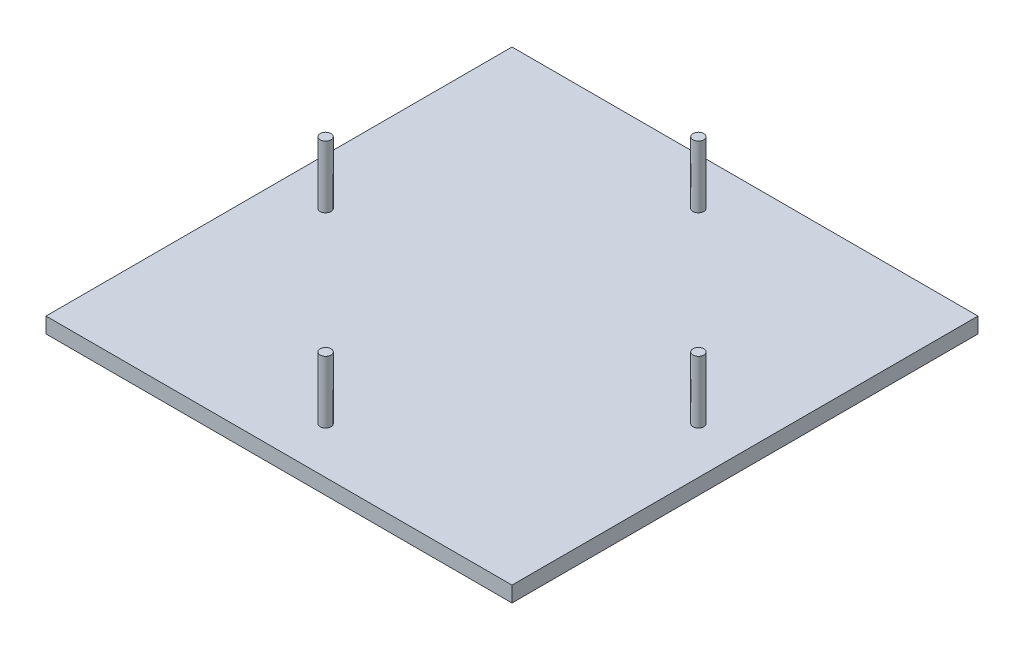
ISO-10303-21;
HEADER;
FILE_DESCRIPTION(('STEP AP214'),'2;1');
FILE_NAME('part.step','',(''),(''),'','','');
FILE_SCHEMA(('AUTOMOTIVE_DESIGN { 1 0 10303 214 1 1 1 1 }'));
ENDSEC;
DATA;
#1=APPLICATION_CONTEXT('core data for automotive mechanical design processes');
#2=APPLICATION_PROTOCOL_DEFINITION('international standard','automotive_design',2000,#1);
#3=PRODUCT_CONTEXT('',#1,'mechanical');
#4=PRODUCT('Part','Part','',(#3));
#5=PRODUCT_RELATED_PRODUCT_CATEGORY('part','',(#4));
#6=PRODUCT_DEFINITION_FORMATION('','',#4);
#7=PRODUCT_DEFINITION_CONTEXT('part definition',#1,'design');
#8=PRODUCT_DEFINITION('design','',#6,#7);
#9=PRODUCT_DEFINITION_SHAPE('','',#8);
#10=(LENGTH_UNIT() NAMED_UNIT(*) SI_UNIT(.MILLI.,.METRE.));
#11=(NAMED_UNIT(*) PLANE_ANGLE_UNIT() SI_UNIT($,.RADIAN.));
#12=(NAMED_UNIT(*) SI_UNIT($,.STERADIAN.) SOLID_ANGLE_UNIT());
#13=UNCERTAINTY_MEASURE_WITH_UNIT(LENGTH_MEASURE(1.E-05),#10,'distance_accuracy_value','');
#14=(GEOMETRIC_REPRESENTATION_CONTEXT(3) GLOBAL_UNCERTAINTY_ASSIGNED_CONTEXT((#13)) GLOBAL_UNIT_ASSIGNED_CONTEXT((#10,
#11,#12)) REPRESENTATION_CONTEXT('',''));
#15=CARTESIAN_POINT('',(0.,0.,0.));
#16=DIRECTION('',(0.,0.,1.));
#17=DIRECTION('',(1.,0.,0.));
#18=AXIS2_PLACEMENT_3D('',#15,#16,#17);
#19=CARTESIAN_POINT('',(75.,5.,-75.));
#20=DIRECTION('',(-1.,0.,0.));
#21=DIRECTION('',(0.,0.,1.));
#22=AXIS2_PLACEMENT_3D('',#19,#20,#21);
#23=PLANE('',#22);
#24=DIRECTION('',(0.,0.,-1.));
#25=VECTOR('',#24,1.);
#26=CARTESIAN_POINT('',(75.,0.,-75.));
#27=LINE('',#26,#25);
#28=CARTESIAN_POINT('',(75.,0.,75.));
#29=VERTEX_POINT('',#28);
#30=CARTESIAN_POINT('',(75.,0.,-75.));
#31=VERTEX_POINT('',#30);
#32=EDGE_CURVE('E116',#29,#31,#27,.T.);
#33=ORIENTED_EDGE('',*,*,#32,.T.);
#34=DIRECTION('',(0.,-1.,0.));
#35=VECTOR('',#34,1.);
#36=CARTESIAN_POINT('',(75.,5.,-75.));
#37=LINE('',#36,#35);
#38=CARTESIAN_POINT('',(75.,5.,-75.));
#39=VERTEX_POINT('',#38);
#40=EDGE_CURVE('E49',#39,#31,#37,.T.);
#41=ORIENTED_EDGE('',*,*,#40,.F.);
#42=DIRECTION('',(0.,0.,-1.));
#43=VECTOR('',#42,1.);
#44=CARTESIAN_POINT('',(75.,5.,-75.));
#45=LINE('',#44,#43);
#46=CARTESIAN_POINT('',(75.,5.,75.));
#47=VERTEX_POINT('',#46);
#48=EDGE_CURVE('E105',#47,#39,#45,.T.);
#49=ORIENTED_EDGE('',*,*,#48,.F.);
#50=DIRECTION('',(0.,-1.,0.));
#51=VECTOR('',#50,1.);
#52=CARTESIAN_POINT('',(75.,5.,75.));
#53=LINE('',#52,#51);
#54=EDGE_CURVE('E113',#47,#29,#53,.T.);
#55=ORIENTED_EDGE('',*,*,#54,.T.);
#56=EDGE_LOOP('',(#33,#41,#49,#55));
#57=FACE_BOUND('',#56,.T.);
#58=ADVANCED_FACE('F50',(#57),#23,.F.);
#59=CARTESIAN_POINT('',(-75.,5.,-75.));
#60=DIRECTION('',(0.,0.,1.));
#61=DIRECTION('',(1.,0.,0.));
#62=AXIS2_PLACEMENT_3D('',#59,#60,#61);
#63=PLANE('',#62);
#64=DIRECTION('',(-1.,0.,0.));
#65=VECTOR('',#64,1.);
#66=CARTESIAN_POINT('',(-75.,0.,-75.));
#67=LINE('',#66,#65);
#68=CARTESIAN_POINT('',(-75.,0.,-75.));
#69=VERTEX_POINT('',#68);
#70=EDGE_CURVE('E107',#31,#69,#67,.T.);
#71=ORIENTED_EDGE('',*,*,#70,.T.);
#72=DIRECTION('',(0.,-1.,0.));
#73=VECTOR('',#72,1.);
#74=CARTESIAN_POINT('',(-75.,5.,-75.));
#75=LINE('',#74,#73);
#76=CARTESIAN_POINT('',(-75.,5.,-75.));
#77=VERTEX_POINT('',#76);
#78=EDGE_CURVE('E106',#77,#69,#75,.T.);
#79=ORIENTED_EDGE('',*,*,#78,.F.);
#80=DIRECTION('',(-1.,0.,0.));
#81=VECTOR('',#80,1.);
#82=CARTESIAN_POINT('',(-75.,5.,-75.));
#83=LINE('',#82,#81);
#84=EDGE_CURVE('E100',#39,#77,#83,.T.);
#85=ORIENTED_EDGE('',*,*,#84,.F.);
#86=ORIENTED_EDGE('',*,*,#40,.T.);
#87=EDGE_LOOP('',(#71,#79,#85,#86));
#88=FACE_BOUND('',#87,.T.);
#89=ADVANCED_FACE('F110',(#88),#63,.F.);
#90=CARTESIAN_POINT('',(-75.,5.,-75.));
#91=DIRECTION('',(1.,0.,0.));
#92=DIRECTION('',(0.,0.,-1.));
#93=AXIS2_PLACEMENT_3D('',#90,#91,#92);
#94=PLANE('',#93);
#95=DIRECTION('',(0.,0.,1.));
#96=VECTOR('',#95,1.);
#97=CARTESIAN_POINT('',(-75.,0.,-75.));
#98=LINE('',#97,#96);
#99=CARTESIAN_POINT('',(-75.,0.,75.));
#100=VERTEX_POINT('',#99);
#101=EDGE_CURVE('E85',#69,#100,#98,.T.);
#102=ORIENTED_EDGE('',*,*,#101,.T.);
#103=DIRECTION('',(0.,-1.,0.));
#104=VECTOR('',#103,1.);
#105=CARTESIAN_POINT('',(-75.,5.,75.));
#106=LINE('',#105,#104);
#107=CARTESIAN_POINT('',(-75.,5.,75.));
#108=VERTEX_POINT('',#107);
#109=EDGE_CURVE('E109',#108,#100,#106,.T.);
#110=ORIENTED_EDGE('',*,*,#109,.F.);
#111=DIRECTION('',(0.,0.,1.));
#112=VECTOR('',#111,1.);
#113=CARTESIAN_POINT('',(-75.,5.,-75.));
#114=LINE('',#113,#112);
#115=EDGE_CURVE('E99',#77,#108,#114,.T.);
#116=ORIENTED_EDGE('',*,*,#115,.F.);
#117=ORIENTED_EDGE('',*,*,#78,.T.);
#118=EDGE_LOOP('',(#102,#110,#116,#117));
#119=FACE_BOUND('',#118,.T.);
#120=ADVANCED_FACE('F112',(#119),#94,.F.);
#121=CARTESIAN_POINT('',(-75.,5.,75.));
#122=DIRECTION('',(0.,0.,-1.));
#123=DIRECTION('',(-1.,0.,0.));
#124=AXIS2_PLACEMENT_3D('',#121,#122,#123);
#125=PLANE('',#124);
#126=DIRECTION('',(1.,0.,0.));
#127=VECTOR('',#126,1.);
#128=CARTESIAN_POINT('',(-75.,0.,75.));
#129=LINE('',#128,#127);
#130=EDGE_CURVE('E90',#100,#29,#129,.T.);
#131=ORIENTED_EDGE('',*,*,#130,.T.);
#132=ORIENTED_EDGE('',*,*,#54,.F.);
#133=DIRECTION('',(1.,0.,0.));
#134=VECTOR('',#133,1.);
#135=CARTESIAN_POINT('',(-75.,5.,75.));
#136=LINE('',#135,#134);
#137=EDGE_CURVE('E67',#108,#47,#136,.T.);
#138=ORIENTED_EDGE('',*,*,#137,.F.);
#139=ORIENTED_EDGE('',*,*,#109,.T.);
#140=EDGE_LOOP('',(#131,#132,#138,#139));
#141=FACE_BOUND('',#140,.T.);
#142=ADVANCED_FACE('F135',(#141),#125,.F.);
#143=CARTESIAN_POINT('',(0.,5.,0.));
#144=DIRECTION('',(0.,1.,0.));
#145=DIRECTION('',(0.,0.,1.));
#146=AXIS2_PLACEMENT_3D('',#143,#144,#145);
#147=PLANE('',#146);
#148=CARTESIAN_POINT('',(-60.,5.,0.));
#149=DIRECTION('',(0.,1.,0.));
#150=DIRECTION('',(0.,0.,1.));
#151=AXIS2_PLACEMENT_3D('',#148,#149,#150);
#152=CIRCLE('',#151,1.75);
#153=CARTESIAN_POINT('',(-60.,5.,1.75));
#154=VERTEX_POINT('',#153);
#155=EDGE_CURVE('E164',#154,#154,#152,.T.);
#156=ORIENTED_EDGE('',*,*,#155,.F.);
#157=EDGE_LOOP('',(#156));
#158=FACE_BOUND('',#157,.T.);
#159=CARTESIAN_POINT('',(2.09488880330588E-13,5.,-60.));
#160=DIRECTION('',(0.,1.,0.));
#161=DIRECTION('',(0.,0.,1.));
#162=AXIS2_PLACEMENT_3D('',#159,#160,#161);
#163=CIRCLE('',#162,1.75);
#164=CARTESIAN_POINT('',(2.09488880330588E-13,5.,-58.25));
#165=VERTEX_POINT('',#164);
#166=EDGE_CURVE('E158',#165,#165,#163,.T.);
#167=ORIENTED_EDGE('',*,*,#166,.F.);
#168=EDGE_LOOP('',(#167));
#169=FACE_BOUND('',#168,.T.);
#170=CARTESIAN_POINT('',(60.,5.,4.18977760661176E-13));
#171=DIRECTION('',(0.,1.,0.));
#172=DIRECTION('',(0.,0.,1.));
#173=AXIS2_PLACEMENT_3D('',#170,#171,#172);
#174=CIRCLE('',#173,1.75000000000001);
#175=CARTESIAN_POINT('',(60.,5.,1.75000000000043));
#176=VERTEX_POINT('',#175);
#177=EDGE_CURVE('E147',#176,#176,#174,.T.);
#178=ORIENTED_EDGE('',*,*,#177,.F.);
#179=EDGE_LOOP('',(#178));
#180=FACE_BOUND('',#179,.T.);
#181=CARTESIAN_POINT('',(-6.28466640991764E-13,5.,60.));
#182=DIRECTION('',(0.,1.,0.));
#183=DIRECTION('',(0.,0.,1.));
#184=AXIS2_PLACEMENT_3D('',#181,#182,#183);
#185=CIRCLE('',#184,1.75000000000001);
#186=CARTESIAN_POINT('',(-6.28466640991764E-13,5.,61.75));
#187=VERTEX_POINT('',#186);
#188=EDGE_CURVE('E148',#187,#187,#185,.T.);
#189=ORIENTED_EDGE('',*,*,#188,.F.);
#190=EDGE_LOOP('',(#189));
#191=FACE_BOUND('',#190,.T.);
#192=ORIENTED_EDGE('',*,*,#48,.T.);
#193=ORIENTED_EDGE('',*,*,#84,.T.);
#194=ORIENTED_EDGE('',*,*,#115,.T.);
#195=ORIENTED_EDGE('',*,*,#137,.T.);
#196=EDGE_LOOP('',(#192,#193,#194,#195));
#197=FACE_BOUND('',#196,.T.);
#198=ADVANCED_FACE('F98',(#158,#169,#180,#191,#197),#147,.T.);
#199=CARTESIAN_POINT('',(0.,0.,0.));
#200=DIRECTION('',(0.,1.,0.));
#201=DIRECTION('',(0.,0.,1.));
#202=AXIS2_PLACEMENT_3D('',#199,#200,#201);
#203=PLANE('',#202);
#204=CARTESIAN_POINT('',(0.,0.,0.));
#205=DIRECTION('',(0.,-1.,0.));
#206=DIRECTION('',(0.,0.,-1.));
#207=AXIS2_PLACEMENT_3D('',#204,#205,#206);
#208=CIRCLE('',#207,15.);
#209=CARTESIAN_POINT('',(0.,0.,-15.));
#210=VERTEX_POINT('',#209);
#211=EDGE_CURVE('E60',#210,#210,#208,.T.);
#212=ORIENTED_EDGE('',*,*,#211,.F.);
#213=EDGE_LOOP('',(#212));
#214=FACE_BOUND('',#213,.T.);
#215=ORIENTED_EDGE('',*,*,#32,.F.);
#216=ORIENTED_EDGE('',*,*,#130,.F.);
#217=ORIENTED_EDGE('',*,*,#101,.F.);
#218=ORIENTED_EDGE('',*,*,#70,.F.);
#219=EDGE_LOOP('',(#215,#216,#217,#218));
#220=FACE_BOUND('',#219,.T.);
#221=ADVANCED_FACE('F137',(#214,#220),#203,.F.);
#222=CARTESIAN_POINT('',(-6.28466640991764E-13,25.,60.));
#223=DIRECTION('',(0.,-1.,0.));
#224=DIRECTION('',(0.,0.,-1.));
#225=AXIS2_PLACEMENT_3D('',#222,#223,#224);
#226=CYLINDRICAL_SURFACE('',#225,1.75000000000001);
#227=CARTESIAN_POINT('',(-6.28466640991764E-13,25.,60.));
#228=DIRECTION('',(0.,1.,0.));
#229=DIRECTION('',(0.,0.,1.));
#230=AXIS2_PLACEMENT_3D('',#227,#228,#229);
#231=CIRCLE('',#230,1.75000000000001);
#232=CARTESIAN_POINT('',(-6.28466640991764E-13,25.,61.75));
#233=VERTEX_POINT('',#232);
#234=EDGE_CURVE('E138',#233,#233,#231,.T.);
#235=ORIENTED_EDGE('',*,*,#234,.F.);
#236=EDGE_LOOP('',(#235));
#237=FACE_BOUND('',#236,.T.);
#238=ORIENTED_EDGE('',*,*,#188,.T.);
#239=EDGE_LOOP('',(#238));
#240=FACE_BOUND('',#239,.T.);
#241=ADVANCED_FACE('F222',(#237,#240),#226,.T.);
#242=CARTESIAN_POINT('',(-6.28466640991764E-13,25.,60.));
#243=DIRECTION('',(0.,1.,0.));
#244=DIRECTION('',(0.,0.,1.));
#245=AXIS2_PLACEMENT_3D('',#242,#243,#244);
#246=PLANE('',#245);
#247=ORIENTED_EDGE('',*,*,#234,.T.);
#248=EDGE_LOOP('',(#247));
#249=FACE_BOUND('',#248,.T.);
#250=ADVANCED_FACE('F227',(#249),#246,.T.);
#251=CARTESIAN_POINT('',(60.,25.,4.18977760661176E-13));
#252=DIRECTION('',(0.,-1.,0.));
#253=DIRECTION('',(0.,0.,-1.));
#254=AXIS2_PLACEMENT_3D('',#251,#252,#253);
#255=CYLINDRICAL_SURFACE('',#254,1.75000000000001);
#256=CARTESIAN_POINT('',(60.,25.,4.18977760661176E-13));
#257=DIRECTION('',(0.,1.,0.));
#258=DIRECTION('',(0.,0.,1.));
#259=AXIS2_PLACEMENT_3D('',#256,#257,#258);
#260=CIRCLE('',#259,1.75000000000001);
#261=CARTESIAN_POINT('',(60.,25.,1.75000000000043));
#262=VERTEX_POINT('',#261);
#263=EDGE_CURVE('E145',#262,#262,#260,.T.);
#264=ORIENTED_EDGE('',*,*,#263,.F.);
#265=EDGE_LOOP('',(#264));
#266=FACE_BOUND('',#265,.T.);
#267=ORIENTED_EDGE('',*,*,#177,.T.);
#268=EDGE_LOOP('',(#267));
#269=FACE_BOUND('',#268,.T.);
#270=ADVANCED_FACE('F226',(#266,#269),#255,.T.);
#271=CARTESIAN_POINT('',(60.,25.,4.18977760661176E-13));
#272=DIRECTION('',(0.,1.,0.));
#273=DIRECTION('',(0.,0.,1.));
#274=AXIS2_PLACEMENT_3D('',#271,#272,#273);
#275=PLANE('',#274);
#276=ORIENTED_EDGE('',*,*,#263,.T.);
#277=EDGE_LOOP('',(#276));
#278=FACE_BOUND('',#277,.T.);
#279=ADVANCED_FACE('F231',(#278),#275,.T.);
#280=CARTESIAN_POINT('',(2.09488880330588E-13,25.,-60.));
#281=DIRECTION('',(0.,-1.,0.));
#282=DIRECTION('',(0.,0.,-1.));
#283=AXIS2_PLACEMENT_3D('',#280,#281,#282);
#284=CYLINDRICAL_SURFACE('',#283,1.75);
#285=CARTESIAN_POINT('',(2.09488880330588E-13,25.,-60.));
#286=DIRECTION('',(0.,1.,0.));
#287=DIRECTION('',(0.,0.,1.));
#288=AXIS2_PLACEMENT_3D('',#285,#286,#287);
#289=CIRCLE('',#288,1.75);
#290=CARTESIAN_POINT('',(2.09488880330588E-13,25.,-58.25));
#291=VERTEX_POINT('',#290);
#292=EDGE_CURVE('E152',#291,#291,#289,.T.);
#293=ORIENTED_EDGE('',*,*,#292,.F.);
#294=EDGE_LOOP('',(#293));
#295=FACE_BOUND('',#294,.T.);
#296=ORIENTED_EDGE('',*,*,#166,.T.);
#297=EDGE_LOOP('',(#296));
#298=FACE_BOUND('',#297,.T.);
#299=ADVANCED_FACE('F240',(#295,#298),#284,.T.);
#300=CARTESIAN_POINT('',(2.09488880330588E-13,25.,-60.));
#301=DIRECTION('',(0.,1.,0.));
#302=DIRECTION('',(0.,0.,1.));
#303=AXIS2_PLACEMENT_3D('',#300,#301,#302);
#304=PLANE('',#303);
#305=ORIENTED_EDGE('',*,*,#292,.T.);
#306=EDGE_LOOP('',(#305));
#307=FACE_BOUND('',#306,.T.);
#308=ADVANCED_FACE('F244',(#307),#304,.T.);
#309=CARTESIAN_POINT('',(-60.,25.,0.));
#310=DIRECTION('',(0.,-1.,0.));
#311=DIRECTION('',(0.,0.,-1.));
#312=AXIS2_PLACEMENT_3D('',#309,#310,#311);
#313=CYLINDRICAL_SURFACE('',#312,1.75);
#314=CARTESIAN_POINT('',(-60.,25.,0.));
#315=DIRECTION('',(0.,1.,0.));
#316=DIRECTION('',(0.,0.,1.));
#317=AXIS2_PLACEMENT_3D('',#314,#315,#316);
#318=CIRCLE('',#317,1.75);
#319=CARTESIAN_POINT('',(-60.,25.,1.75));
#320=VERTEX_POINT('',#319);
#321=EDGE_CURVE('E125',#320,#320,#318,.T.);
#322=ORIENTED_EDGE('',*,*,#321,.F.);
#323=EDGE_LOOP('',(#322));
#324=FACE_BOUND('',#323,.T.);
#325=ORIENTED_EDGE('',*,*,#155,.T.);
#326=EDGE_LOOP('',(#325));
#327=FACE_BOUND('',#326,.T.);
#328=ADVANCED_FACE('F243',(#324,#327),#313,.T.);
#329=CARTESIAN_POINT('',(-60.,25.,0.));
#330=DIRECTION('',(0.,1.,0.));
#331=DIRECTION('',(0.,0.,1.));
#332=AXIS2_PLACEMENT_3D('',#329,#330,#331);
#333=PLANE('',#332);
#334=ORIENTED_EDGE('',*,*,#321,.T.);
#335=EDGE_LOOP('',(#334));
#336=FACE_BOUND('',#335,.T.);
#337=ADVANCED_FACE('F252',(#336),#333,.T.);
#338=CARTESIAN_POINT('',(0.,-2.,0.));
#339=DIRECTION('',(0.,1.,0.));
#340=DIRECTION('',(0.,0.,1.));
#341=AXIS2_PLACEMENT_3D('',#338,#339,#340);
#342=CYLINDRICAL_SURFACE('',#341,15.);
#343=CARTESIAN_POINT('',(0.,-2.,0.));
#344=DIRECTION('',(0.,-1.,0.));
#345=DIRECTION('',(0.,0.,-1.));
#346=AXIS2_PLACEMENT_3D('',#343,#344,#345);
#347=CIRCLE('',#346,15.);
#348=CARTESIAN_POINT('',(0.,-2.,-15.));
#349=VERTEX_POINT('',#348);
#350=EDGE_CURVE('E144',#349,#349,#347,.T.);
#351=ORIENTED_EDGE('',*,*,#350,.F.);
#352=EDGE_LOOP('',(#351));
#353=FACE_BOUND('',#352,.T.);
#354=ORIENTED_EDGE('',*,*,#211,.T.);
#355=EDGE_LOOP('',(#354));
#356=FACE_BOUND('',#355,.T.);
#357=ADVANCED_FACE('F258',(#353,#356),#342,.T.);
#358=CARTESIAN_POINT('',(0.,-2.,0.));
#359=DIRECTION('',(0.,-1.,0.));
#360=DIRECTION('',(0.,0.,-1.));
#361=AXIS2_PLACEMENT_3D('',#358,#359,#360);
#362=PLANE('',#361);
#363=CARTESIAN_POINT('',(0.,-2.,0.));
#364=DIRECTION('',(0.,-1.,0.));
#365=DIRECTION('',(0.,0.,-1.));
#366=AXIS2_PLACEMENT_3D('',#363,#364,#365);
#367=CIRCLE('',#366,6.);
#368=CARTESIAN_POINT('',(0.,-2.,-6.));
#369=VERTEX_POINT('',#368);
#370=EDGE_CURVE('E11',#369,#369,#367,.T.);
#371=ORIENTED_EDGE('',*,*,#370,.F.);
#372=EDGE_LOOP('',(#371));
#373=FACE_BOUND('',#372,.T.);
#374=ORIENTED_EDGE('',*,*,#350,.T.);
#375=EDGE_LOOP('',(#374));
#376=FACE_BOUND('',#375,.T.);
#377=ADVANCED_FACE('F257',(#373,#376),#362,.T.);
#378=CARTESIAN_POINT('',(0.,-12.,0.));
#379=DIRECTION('',(0.,1.,0.));
#380=DIRECTION('',(0.,0.,1.));
#381=AXIS2_PLACEMENT_3D('',#378,#379,#380);
#382=CYLINDRICAL_SURFACE('',#381,6.);
#383=CARTESIAN_POINT('',(0.,-12.,0.));
#384=DIRECTION('',(0.,-1.,0.));
#385=DIRECTION('',(0.,0.,-1.));
#386=AXIS2_PLACEMENT_3D('',#383,#384,#385);
#387=CIRCLE('',#386,6.);
#388=CARTESIAN_POINT('',(0.,-12.,-6.));
#389=VERTEX_POINT('',#388);
#390=EDGE_CURVE('E179',#389,#389,#387,.T.);
#391=ORIENTED_EDGE('',*,*,#390,.F.);
#392=EDGE_LOOP('',(#391));
#393=FACE_BOUND('',#392,.T.);
#394=ORIENTED_EDGE('',*,*,#370,.T.);
#395=EDGE_LOOP('',(#394));
#396=FACE_BOUND('',#395,.T.);
#397=ADVANCED_FACE('F198',(#393,#396),#382,.T.);
#398=CARTESIAN_POINT('',(0.,-15.,0.));
#399=DIRECTION('',(0.,1.,0.));
#400=DIRECTION('',(0.,0.,1.));
#401=AXIS2_PLACEMENT_3D('',#398,#399,#400);
#402=CYLINDRICAL_SURFACE('',#401,15.);
#403=CARTESIAN_POINT('',(0.,-15.,0.));
#404=DIRECTION('',(0.,-1.,0.));
#405=DIRECTION('',(0.,0.,-1.));
#406=AXIS2_PLACEMENT_3D('',#403,#404,#405);
#407=CIRCLE('',#406,15.);
#408=CARTESIAN_POINT('',(0.,-15.,-15.));
#409=VERTEX_POINT('',#408);
#410=EDGE_CURVE('E185',#409,#409,#407,.T.);
#411=ORIENTED_EDGE('',*,*,#410,.F.);
#412=EDGE_LOOP('',(#411));
#413=FACE_BOUND('',#412,.T.);
#414=CARTESIAN_POINT('',(0.,-12.,0.));
#415=DIRECTION('',(0.,-1.,0.));
#416=DIRECTION('',(0.,0.,-1.));
#417=AXIS2_PLACEMENT_3D('',#414,#415,#416);
#418=CIRCLE('',#417,15.);
#419=CARTESIAN_POINT('',(0.,-12.,-15.));
#420=VERTEX_POINT('',#419);
#421=EDGE_CURVE('E181',#420,#420,#418,.T.);
#422=ORIENTED_EDGE('',*,*,#421,.T.);
#423=EDGE_LOOP('',(#422));
#424=FACE_BOUND('',#423,.T.);
#425=ADVANCED_FACE('F195',(#413,#424),#402,.T.);
#426=CARTESIAN_POINT('',(0.,-15.,0.));
#427=DIRECTION('',(0.,-1.,0.));
#428=DIRECTION('',(0.,0.,-1.));
#429=AXIS2_PLACEMENT_3D('',#426,#427,#428);
#430=PLANE('',#429);
#431=ORIENTED_EDGE('',*,*,#410,.T.);
#432=EDGE_LOOP('',(#431));
#433=FACE_BOUND('',#432,.T.);
#434=ADVANCED_FACE('F192',(#433),#430,.T.);
#435=CARTESIAN_POINT('',(0.,-12.,0.));
#436=DIRECTION('',(0.,-1.,0.));
#437=DIRECTION('',(0.,0.,-1.));
#438=AXIS2_PLACEMENT_3D('',#435,#436,#437);
#439=PLANE('',#438);
#440=ORIENTED_EDGE('',*,*,#390,.T.);
#441=EDGE_LOOP('',(#440));
#442=FACE_BOUND('',#441,.T.);
#443=ORIENTED_EDGE('',*,*,#421,.F.);
#444=EDGE_LOOP('',(#443));
#445=FACE_BOUND('',#444,.T.);
#446=ADVANCED_FACE('F199',(#442,#445),#439,.F.);
#447=CLOSED_SHELL('',(#58,#89,#120,#142,#198,#221,#241,#250,#270,#279,#299,#308,#328,#337,#357,
#377,#397,#425,#434,#446));
#448=MANIFOLD_SOLID_BREP('B2',#447);
#449=ADVANCED_BREP_SHAPE_REPRESENTATION('',(#18,#448),#14);
#450=SHAPE_DEFINITION_REPRESENTATION(#9,#449);
ENDSEC;
END-ISO-10303-21;
